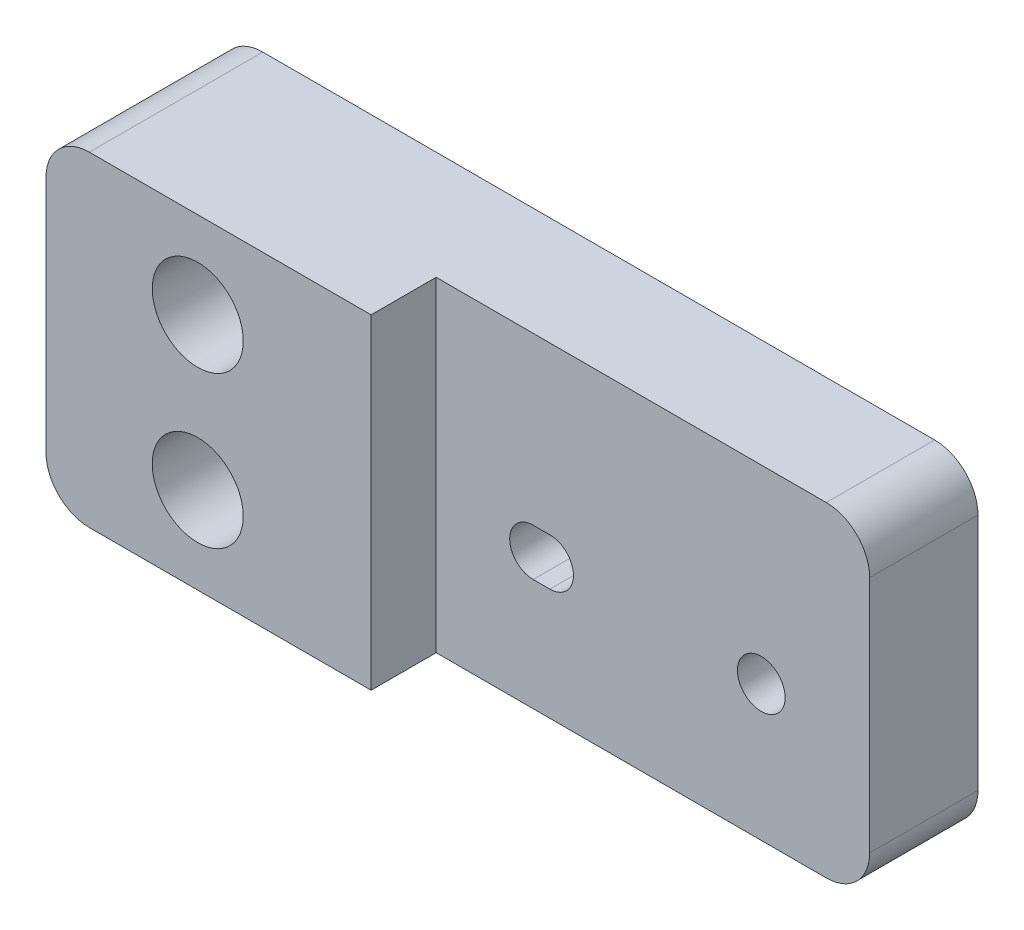
ISO-10303-21;
HEADER;
FILE_DESCRIPTION(('STEP AP214'),'2;1');
FILE_NAME('part.step','',(''),(''),'','','');
FILE_SCHEMA(('AUTOMOTIVE_DESIGN { 1 0 10303 214 1 1 1 1 }'));
ENDSEC;
DATA;
#1=APPLICATION_CONTEXT('core data for automotive mechanical design processes');
#2=APPLICATION_PROTOCOL_DEFINITION('international standard','automotive_design',2000,#1);
#3=PRODUCT_CONTEXT('',#1,'mechanical');
#4=PRODUCT('Part','Part','',(#3));
#5=PRODUCT_RELATED_PRODUCT_CATEGORY('part','',(#4));
#6=PRODUCT_DEFINITION_FORMATION('','',#4);
#7=PRODUCT_DEFINITION_CONTEXT('part definition',#1,'design');
#8=PRODUCT_DEFINITION('design','',#6,#7);
#9=PRODUCT_DEFINITION_SHAPE('','',#8);
#10=(LENGTH_UNIT() NAMED_UNIT(*) SI_UNIT(.MILLI.,.METRE.));
#11=(NAMED_UNIT(*) PLANE_ANGLE_UNIT() SI_UNIT($,.RADIAN.));
#12=(NAMED_UNIT(*) SI_UNIT($,.STERADIAN.) SOLID_ANGLE_UNIT());
#13=UNCERTAINTY_MEASURE_WITH_UNIT(LENGTH_MEASURE(1.E-05),#10,'distance_accuracy_value','');
#14=(GEOMETRIC_REPRESENTATION_CONTEXT(3) GLOBAL_UNCERTAINTY_ASSIGNED_CONTEXT((#13)) GLOBAL_UNIT_ASSIGNED_CONTEXT((#10,
#11,#12)) REPRESENTATION_CONTEXT('',''));
#15=CARTESIAN_POINT('',(0.,0.,0.));
#16=DIRECTION('',(0.,0.,1.));
#17=DIRECTION('',(1.,0.,0.));
#18=AXIS2_PLACEMENT_3D('',#15,#16,#17);
#19=CARTESIAN_POINT('',(-13.,-12.25,5.));
#20=DIRECTION('',(0.,0.,-1.));
#21=DIRECTION('',(-1.,0.,0.));
#22=AXIS2_PLACEMENT_3D('',#19,#20,#21);
#23=PLANE('',#22);
#24=CARTESIAN_POINT('',(15.,-7.99752344134587,5.));
#25=DIRECTION('',(0.,0.,-1.));
#26=DIRECTION('',(-1.,0.,0.));
#27=AXIS2_PLACEMENT_3D('',#24,#25,#26);
#28=CIRCLE('',#27,1.1);
#29=CARTESIAN_POINT('',(13.9,-7.99752344134587,5.));
#30=VERTEX_POINT('',#29);
#31=EDGE_CURVE('E269',#30,#30,#28,.T.);
#32=ORIENTED_EDGE('',*,*,#31,.T.);
#33=EDGE_LOOP('',(#32));
#34=FACE_BOUND('',#33,.T.);
#35=DIRECTION('',(1.,0.,0.));
#36=VECTOR('',#35,1.);
#37=CARTESIAN_POINT('',(-13.,-6.91475813064418,5.));
#38=LINE('',#37,#36);
#39=CARTESIAN_POINT('',(4.47844965742789,-6.91475813064418,5.));
#40=VERTEX_POINT('',#39);
#41=CARTESIAN_POINT('',(5.24999988265336,-6.91475813064418,5.));
#42=VERTEX_POINT('',#41);
#43=EDGE_CURVE('E263',#40,#42,#38,.T.);
#44=ORIENTED_EDGE('',*,*,#43,.T.);
#45=CARTESIAN_POINT('',(5.24999988265336,-7.99999981001019,5.));
#46=DIRECTION('',(0.,0.,-1.));
#47=DIRECTION('',(-1.,0.,0.));
#48=AXIS2_PLACEMENT_3D('',#45,#46,#47);
#49=CIRCLE('',#48,1.08524167936601);
#50=CARTESIAN_POINT('',(5.24999988265336,-9.0852414893762,5.));
#51=VERTEX_POINT('',#50);
#52=EDGE_CURVE('E266',#42,#51,#49,.T.);
#53=ORIENTED_EDGE('',*,*,#52,.T.);
#54=DIRECTION('',(-1.,0.,0.));
#55=VECTOR('',#54,1.);
#56=CARTESIAN_POINT('',(-13.,-9.0852414893762,5.));
#57=LINE('',#56,#55);
#58=CARTESIAN_POINT('',(4.47844965742789,-9.0852414893762,5.));
#59=VERTEX_POINT('',#58);
#60=EDGE_CURVE('E260',#51,#59,#57,.T.);
#61=ORIENTED_EDGE('',*,*,#60,.T.);
#62=CARTESIAN_POINT('',(4.47844965742789,-7.99999981001019,5.));
#63=DIRECTION('',(0.,0.,-1.));
#64=DIRECTION('',(-1.,0.,0.));
#65=AXIS2_PLACEMENT_3D('',#62,#63,#64);
#66=CIRCLE('',#65,1.08524167936601);
#67=EDGE_CURVE('E237',#59,#40,#66,.T.);
#68=ORIENTED_EDGE('',*,*,#67,.T.);
#69=EDGE_LOOP('',(#44,#53,#61,#68));
#70=FACE_BOUND('',#69,.T.);
#71=DIRECTION('',(-1.,0.,0.));
#72=VECTOR('',#71,1.);
#73=CARTESIAN_POINT('',(18.,0.749999999999999,5.));
#74=LINE('',#73,#72);
#75=CARTESIAN_POINT('',(18.,0.749999999999999,5.));
#76=VERTEX_POINT('',#75);
#77=CARTESIAN_POINT('',(0.,0.749999999999996,5.));
#78=VERTEX_POINT('',#77);
#79=EDGE_CURVE('E322',#76,#78,#74,.T.);
#80=ORIENTED_EDGE('',*,*,#79,.T.);
#81=DIRECTION('',(0.,-1.,0.));
#82=VECTOR('',#81,1.);
#83=CARTESIAN_POINT('',(0.,0.749999999999996,5.));
#84=LINE('',#83,#82);
#85=CARTESIAN_POINT('',(0.,-14.25,5.));
#86=VERTEX_POINT('',#85);
#87=EDGE_CURVE('E278',#78,#86,#84,.T.);
#88=ORIENTED_EDGE('',*,*,#87,.T.);
#89=DIRECTION('',(-1.,0.,0.));
#90=VECTOR('',#89,1.);
#91=CARTESIAN_POINT('',(18.,-14.25,5.));
#92=LINE('',#91,#90);
#93=CARTESIAN_POINT('',(18.,-14.25,5.));
#94=VERTEX_POINT('',#93);
#95=EDGE_CURVE('E309',#94,#86,#92,.T.);
#96=ORIENTED_EDGE('',*,*,#95,.F.);
#97=CARTESIAN_POINT('',(18.,-12.25,5.));
#98=DIRECTION('',(0.,0.,-1.));
#99=DIRECTION('',(-1.,0.,0.));
#100=AXIS2_PLACEMENT_3D('',#97,#98,#99);
#101=CIRCLE('',#100,2.);
#102=CARTESIAN_POINT('',(20.,-12.25,5.));
#103=VERTEX_POINT('',#102);
#104=EDGE_CURVE('E312',#103,#94,#101,.T.);
#105=ORIENTED_EDGE('',*,*,#104,.F.);
#106=DIRECTION('',(0.,-1.,0.));
#107=VECTOR('',#106,1.);
#108=CARTESIAN_POINT('',(20.,-1.25000000000001,5.));
#109=LINE('',#108,#107);
#110=CARTESIAN_POINT('',(20.,-1.25000000000001,5.));
#111=VERTEX_POINT('',#110);
#112=EDGE_CURVE('E316',#111,#103,#109,.T.);
#113=ORIENTED_EDGE('',*,*,#112,.F.);
#114=CARTESIAN_POINT('',(18.,-1.25,5.));
#115=DIRECTION('',(0.,0.,-1.));
#116=DIRECTION('',(-1.,0.,0.));
#117=AXIS2_PLACEMENT_3D('',#114,#115,#116);
#118=CIRCLE('',#117,2.);
#119=EDGE_CURVE('E319',#76,#111,#118,.T.);
#120=ORIENTED_EDGE('',*,*,#119,.F.);
#121=EDGE_LOOP('',(#80,#88,#96,#105,#113,#120));
#122=FACE_BOUND('',#121,.T.);
#123=ADVANCED_FACE('F131',(#34,#70,#122),#23,.F.);
#124=CARTESIAN_POINT('',(-13.,-12.25,0.));
#125=DIRECTION('',(0.,0.,-1.));
#126=DIRECTION('',(-1.,0.,0.));
#127=AXIS2_PLACEMENT_3D('',#124,#125,#126);
#128=PLANE('',#127);
#129=CARTESIAN_POINT('',(15.,-7.99752344134587,0.));
#130=DIRECTION('',(0.,0.,-1.));
#131=DIRECTION('',(-1.,0.,0.));
#132=AXIS2_PLACEMENT_3D('',#129,#130,#131);
#133=CIRCLE('',#132,1.1);
#134=CARTESIAN_POINT('',(13.9,-7.99752344134587,0.));
#135=VERTEX_POINT('',#134);
#136=EDGE_CURVE('E257',#135,#135,#133,.T.);
#137=ORIENTED_EDGE('',*,*,#136,.F.);
#138=EDGE_LOOP('',(#137));
#139=FACE_BOUND('',#138,.T.);
#140=CARTESIAN_POINT('',(5.24999988265336,-7.99999981001019,0.));
#141=DIRECTION('',(0.,0.,-1.));
#142=DIRECTION('',(-1.,0.,0.));
#143=AXIS2_PLACEMENT_3D('',#140,#141,#142);
#144=CIRCLE('',#143,1.08524167936601);
#145=CARTESIAN_POINT('',(5.24999988265336,-6.91475813064418,0.));
#146=VERTEX_POINT('',#145);
#147=CARTESIAN_POINT('',(5.24999988265336,-9.0852414893762,0.));
#148=VERTEX_POINT('',#147);
#149=EDGE_CURVE('E154',#146,#148,#144,.T.);
#150=ORIENTED_EDGE('',*,*,#149,.F.);
#151=DIRECTION('',(1.,0.,0.));
#152=VECTOR('',#151,1.);
#153=CARTESIAN_POINT('',(5.24999988265336,-6.91475813064418,0.));
#154=LINE('',#153,#152);
#155=CARTESIAN_POINT('',(4.47844965742789,-6.91475813064418,0.));
#156=VERTEX_POINT('',#155);
#157=EDGE_CURVE('E250',#156,#146,#154,.T.);
#158=ORIENTED_EDGE('',*,*,#157,.F.);
#159=CARTESIAN_POINT('',(4.47844965742789,-7.99999981001019,0.));
#160=DIRECTION('',(0.,0.,-1.));
#161=DIRECTION('',(-1.,0.,0.));
#162=AXIS2_PLACEMENT_3D('',#159,#160,#161);
#163=CIRCLE('',#162,1.08524167936601);
#164=CARTESIAN_POINT('',(4.47844965742789,-9.0852414893762,0.));
#165=VERTEX_POINT('',#164);
#166=EDGE_CURVE('E234',#165,#156,#163,.T.);
#167=ORIENTED_EDGE('',*,*,#166,.F.);
#168=DIRECTION('',(-1.,0.,0.));
#169=VECTOR('',#168,1.);
#170=CARTESIAN_POINT('',(5.24999988265336,-9.0852414893762,0.));
#171=LINE('',#170,#169);
#172=EDGE_CURVE('E243',#148,#165,#171,.T.);
#173=ORIENTED_EDGE('',*,*,#172,.F.);
#174=EDGE_LOOP('',(#150,#158,#167,#173));
#175=FACE_BOUND('',#174,.T.);
#176=CARTESIAN_POINT('',(-8.,-10.25,0.));
#177=DIRECTION('',(0.,0.,1.));
#178=DIRECTION('',(1.,0.,0.));
#179=AXIS2_PLACEMENT_3D('',#176,#177,#178);
#180=CIRCLE('',#179,2.1);
#181=CARTESIAN_POINT('',(-5.9,-10.25,0.));
#182=VERTEX_POINT('',#181);
#183=EDGE_CURVE('E305',#182,#182,#180,.T.);
#184=ORIENTED_EDGE('',*,*,#183,.T.);
#185=EDGE_LOOP('',(#184));
#186=FACE_BOUND('',#185,.T.);
#187=DIRECTION('',(0.,-1.,0.));
#188=VECTOR('',#187,1.);
#189=CARTESIAN_POINT('',(-15.,-1.25,0.));
#190=LINE('',#189,#188);
#191=CARTESIAN_POINT('',(-15.,-1.25,0.));
#192=VERTEX_POINT('',#191);
#193=CARTESIAN_POINT('',(-15.,-12.25,0.));
#194=VERTEX_POINT('',#193);
#195=EDGE_CURVE('E308',#192,#194,#190,.T.);
#196=ORIENTED_EDGE('',*,*,#195,.F.);
#197=CARTESIAN_POINT('',(-13.,-1.25,0.));
#198=DIRECTION('',(0.,0.,1.));
#199=DIRECTION('',(1.,0.,0.));
#200=AXIS2_PLACEMENT_3D('',#197,#198,#199);
#201=CIRCLE('',#200,2.);
#202=CARTESIAN_POINT('',(-13.,0.749999999999996,0.));
#203=VERTEX_POINT('',#202);
#204=EDGE_CURVE('E313',#203,#192,#201,.T.);
#205=ORIENTED_EDGE('',*,*,#204,.F.);
#206=DIRECTION('',(-1.,0.,0.));
#207=VECTOR('',#206,1.);
#208=CARTESIAN_POINT('',(18.,0.749999999999999,0.));
#209=LINE('',#208,#207);
#210=CARTESIAN_POINT('',(18.,0.749999999999999,0.));
#211=VERTEX_POINT('',#210);
#212=EDGE_CURVE('E343',#211,#203,#209,.T.);
#213=ORIENTED_EDGE('',*,*,#212,.F.);
#214=CARTESIAN_POINT('',(18.,-1.25,0.));
#215=DIRECTION('',(0.,0.,-1.));
#216=DIRECTION('',(-1.,0.,0.));
#217=AXIS2_PLACEMENT_3D('',#214,#215,#216);
#218=CIRCLE('',#217,2.);
#219=CARTESIAN_POINT('',(20.,-1.25000000000001,0.));
#220=VERTEX_POINT('',#219);
#221=EDGE_CURVE('E340',#211,#220,#218,.T.);
#222=ORIENTED_EDGE('',*,*,#221,.T.);
#223=DIRECTION('',(0.,-1.,0.));
#224=VECTOR('',#223,1.);
#225=CARTESIAN_POINT('',(20.,-1.25000000000001,0.));
#226=LINE('',#225,#224);
#227=CARTESIAN_POINT('',(20.,-12.25,0.));
#228=VERTEX_POINT('',#227);
#229=EDGE_CURVE('E337',#220,#228,#226,.T.);
#230=ORIENTED_EDGE('',*,*,#229,.T.);
#231=CARTESIAN_POINT('',(18.,-12.25,0.));
#232=DIRECTION('',(0.,0.,-1.));
#233=DIRECTION('',(-1.,0.,0.));
#234=AXIS2_PLACEMENT_3D('',#231,#232,#233);
#235=CIRCLE('',#234,2.);
#236=CARTESIAN_POINT('',(18.,-14.25,0.));
#237=VERTEX_POINT('',#236);
#238=EDGE_CURVE('E334',#228,#237,#235,.T.);
#239=ORIENTED_EDGE('',*,*,#238,.T.);
#240=DIRECTION('',(-1.,0.,0.));
#241=VECTOR('',#240,1.);
#242=CARTESIAN_POINT('',(18.,-14.25,0.));
#243=LINE('',#242,#241);
#244=CARTESIAN_POINT('',(-13.,-14.25,0.));
#245=VERTEX_POINT('',#244);
#246=EDGE_CURVE('E331',#237,#245,#243,.T.);
#247=ORIENTED_EDGE('',*,*,#246,.T.);
#248=CARTESIAN_POINT('',(-13.,-12.25,0.));
#249=DIRECTION('',(0.,0.,-1.));
#250=DIRECTION('',(-1.,0.,0.));
#251=AXIS2_PLACEMENT_3D('',#248,#249,#250);
#252=CIRCLE('',#251,2.);
#253=EDGE_CURVE('E328',#245,#194,#252,.T.);
#254=ORIENTED_EDGE('',*,*,#253,.T.);
#255=EDGE_LOOP('',(#196,#205,#213,#222,#230,#239,#247,#254));
#256=FACE_BOUND('',#255,.T.);
#257=CARTESIAN_POINT('',(-8.,-3.25,0.));
#258=DIRECTION('',(0.,0.,1.));
#259=DIRECTION('',(1.,0.,0.));
#260=AXIS2_PLACEMENT_3D('',#257,#258,#259);
#261=CIRCLE('',#260,2.1);
#262=CARTESIAN_POINT('',(-5.9,-3.25,0.));
#263=VERTEX_POINT('',#262);
#264=EDGE_CURVE('E302',#263,#263,#261,.T.);
#265=ORIENTED_EDGE('',*,*,#264,.T.);
#266=EDGE_LOOP('',(#265));
#267=FACE_BOUND('',#266,.T.);
#268=ADVANCED_FACE('F247',(#139,#175,#186,#256,#267),#128,.T.);
#269=CARTESIAN_POINT('',(-15.,-1.25,5.));
#270=DIRECTION('',(1.,0.,0.));
#271=DIRECTION('',(0.,1.,0.));
#272=AXIS2_PLACEMENT_3D('',#269,#270,#271);
#273=PLANE('',#272);
#274=ORIENTED_EDGE('',*,*,#195,.T.);
#275=DIRECTION('',(0.,0.,-1.));
#276=VECTOR('',#275,1.);
#277=CARTESIAN_POINT('',(-15.,-12.25,5.));
#278=LINE('',#277,#276);
#279=CARTESIAN_POINT('',(-15.,-12.25,8.));
#280=VERTEX_POINT('',#279);
#281=EDGE_CURVE('E12',#280,#194,#278,.T.);
#282=ORIENTED_EDGE('',*,*,#281,.F.);
#283=DIRECTION('',(0.,-1.,0.));
#284=VECTOR('',#283,1.);
#285=CARTESIAN_POINT('',(-15.,-1.25,8.));
#286=LINE('',#285,#284);
#287=CARTESIAN_POINT('',(-15.,-1.25,8.));
#288=VERTEX_POINT('',#287);
#289=EDGE_CURVE('E282',#288,#280,#286,.T.);
#290=ORIENTED_EDGE('',*,*,#289,.F.);
#291=DIRECTION('',(0.,0.,-1.));
#292=VECTOR('',#291,1.);
#293=CARTESIAN_POINT('',(-15.,-1.25,5.));
#294=LINE('',#293,#292);
#295=EDGE_CURVE('E325',#288,#192,#294,.T.);
#296=ORIENTED_EDGE('',*,*,#295,.T.);
#297=EDGE_LOOP('',(#274,#282,#290,#296));
#298=FACE_BOUND('',#297,.T.);
#299=ADVANCED_FACE('F133',(#298),#273,.F.);
#300=CARTESIAN_POINT('',(-13.,-12.25,5.));
#301=DIRECTION('',(0.,0.,-1.));
#302=DIRECTION('',(-1.,0.,0.));
#303=AXIS2_PLACEMENT_3D('',#300,#301,#302);
#304=CYLINDRICAL_SURFACE('',#303,2.);
#305=ORIENTED_EDGE('',*,*,#253,.F.);
#306=DIRECTION('',(0.,0.,-1.));
#307=VECTOR('',#306,1.);
#308=CARTESIAN_POINT('',(-13.,-14.25,5.));
#309=LINE('',#308,#307);
#310=CARTESIAN_POINT('',(-13.,-14.25,8.));
#311=VERTEX_POINT('',#310);
#312=EDGE_CURVE('E139',#311,#245,#309,.T.);
#313=ORIENTED_EDGE('',*,*,#312,.F.);
#314=CARTESIAN_POINT('',(-13.,-12.25,8.));
#315=DIRECTION('',(0.,0.,1.));
#316=DIRECTION('',(1.,0.,0.));
#317=AXIS2_PLACEMENT_3D('',#314,#315,#316);
#318=CIRCLE('',#317,2.);
#319=EDGE_CURVE('E285',#280,#311,#318,.T.);
#320=ORIENTED_EDGE('',*,*,#319,.F.);
#321=ORIENTED_EDGE('',*,*,#281,.T.);
#322=EDGE_LOOP('',(#305,#313,#320,#321));
#323=FACE_BOUND('',#322,.T.);
#324=ADVANCED_FACE('F366',(#323),#304,.T.);
#325=CARTESIAN_POINT('',(18.,-14.25,5.));
#326=DIRECTION('',(0.,-1.,0.));
#327=DIRECTION('',(1.,0.,0.));
#328=AXIS2_PLACEMENT_3D('',#325,#326,#327);
#329=PLANE('',#328);
#330=ORIENTED_EDGE('',*,*,#246,.F.);
#331=DIRECTION('',(0.,0.,-1.));
#332=VECTOR('',#331,1.);
#333=CARTESIAN_POINT('',(18.,-14.25,5.));
#334=LINE('',#333,#332);
#335=EDGE_CURVE('E357',#94,#237,#334,.T.);
#336=ORIENTED_EDGE('',*,*,#335,.F.);
#337=ORIENTED_EDGE('',*,*,#95,.T.);
#338=DIRECTION('',(0.,0.,-1.));
#339=VECTOR('',#338,1.);
#340=CARTESIAN_POINT('',(0.,-14.25,8.));
#341=LINE('',#340,#339);
#342=CARTESIAN_POINT('',(0.,-14.25,8.));
#343=VERTEX_POINT('',#342);
#344=EDGE_CURVE('E300',#343,#86,#341,.T.);
#345=ORIENTED_EDGE('',*,*,#344,.F.);
#346=DIRECTION('',(1.,0.,0.));
#347=VECTOR('',#346,1.);
#348=CARTESIAN_POINT('',(-13.,-14.25,8.));
#349=LINE('',#348,#347);
#350=EDGE_CURVE('E288',#311,#343,#349,.T.);
#351=ORIENTED_EDGE('',*,*,#350,.F.);
#352=ORIENTED_EDGE('',*,*,#312,.T.);
#353=EDGE_LOOP('',(#330,#336,#337,#345,#351,#352));
#354=FACE_BOUND('',#353,.T.);
#355=ADVANCED_FACE('F362',(#354),#329,.T.);
#356=CARTESIAN_POINT('',(18.,-12.25,5.));
#357=DIRECTION('',(0.,0.,-1.));
#358=DIRECTION('',(-1.,0.,0.));
#359=AXIS2_PLACEMENT_3D('',#356,#357,#358);
#360=CYLINDRICAL_SURFACE('',#359,2.);
#361=ORIENTED_EDGE('',*,*,#238,.F.);
#362=DIRECTION('',(0.,0.,-1.));
#363=VECTOR('',#362,1.);
#364=CARTESIAN_POINT('',(20.,-12.25,5.));
#365=LINE('',#364,#363);
#366=EDGE_CURVE('E355',#103,#228,#365,.T.);
#367=ORIENTED_EDGE('',*,*,#366,.F.);
#368=ORIENTED_EDGE('',*,*,#104,.T.);
#369=ORIENTED_EDGE('',*,*,#335,.T.);
#370=EDGE_LOOP('',(#361,#367,#368,#369));
#371=FACE_BOUND('',#370,.T.);
#372=ADVANCED_FACE('F373',(#371),#360,.T.);
#373=CARTESIAN_POINT('',(20.,-1.25000000000001,5.));
#374=DIRECTION('',(1.,0.,0.));
#375=DIRECTION('',(0.,1.,0.));
#376=AXIS2_PLACEMENT_3D('',#373,#374,#375);
#377=PLANE('',#376);
#378=ORIENTED_EDGE('',*,*,#229,.F.);
#379=DIRECTION('',(0.,0.,-1.));
#380=VECTOR('',#379,1.);
#381=CARTESIAN_POINT('',(20.,-1.25000000000001,5.));
#382=LINE('',#381,#380);
#383=EDGE_CURVE('E353',#111,#220,#382,.T.);
#384=ORIENTED_EDGE('',*,*,#383,.F.);
#385=ORIENTED_EDGE('',*,*,#112,.T.);
#386=ORIENTED_EDGE('',*,*,#366,.T.);
#387=EDGE_LOOP('',(#378,#384,#385,#386));
#388=FACE_BOUND('',#387,.T.);
#389=ADVANCED_FACE('F401',(#388),#377,.T.);
#390=CARTESIAN_POINT('',(18.,-1.25,5.));
#391=DIRECTION('',(0.,0.,-1.));
#392=DIRECTION('',(-1.,0.,0.));
#393=AXIS2_PLACEMENT_3D('',#390,#391,#392);
#394=CYLINDRICAL_SURFACE('',#393,2.);
#395=ORIENTED_EDGE('',*,*,#221,.F.);
#396=DIRECTION('',(0.,0.,-1.));
#397=VECTOR('',#396,1.);
#398=CARTESIAN_POINT('',(18.,0.749999999999999,5.));
#399=LINE('',#398,#397);
#400=EDGE_CURVE('E351',#76,#211,#399,.T.);
#401=ORIENTED_EDGE('',*,*,#400,.F.);
#402=ORIENTED_EDGE('',*,*,#119,.T.);
#403=ORIENTED_EDGE('',*,*,#383,.T.);
#404=EDGE_LOOP('',(#395,#401,#402,#403));
#405=FACE_BOUND('',#404,.T.);
#406=ADVANCED_FACE('F399',(#405),#394,.T.);
#407=CARTESIAN_POINT('',(18.,0.749999999999999,5.));
#408=DIRECTION('',(0.,-1.,0.));
#409=DIRECTION('',(1.,0.,0.));
#410=AXIS2_PLACEMENT_3D('',#407,#408,#409);
#411=PLANE('',#410);
#412=ORIENTED_EDGE('',*,*,#212,.T.);
#413=DIRECTION('',(0.,0.,-1.));
#414=VECTOR('',#413,1.);
#415=CARTESIAN_POINT('',(-13.,0.749999999999996,5.));
#416=LINE('',#415,#414);
#417=CARTESIAN_POINT('',(-13.,0.749999999999996,8.));
#418=VERTEX_POINT('',#417);
#419=EDGE_CURVE('E348',#418,#203,#416,.T.);
#420=ORIENTED_EDGE('',*,*,#419,.F.);
#421=DIRECTION('',(-1.,0.,0.));
#422=VECTOR('',#421,1.);
#423=CARTESIAN_POINT('',(0.,0.749999999999996,8.));
#424=LINE('',#423,#422);
#425=CARTESIAN_POINT('',(0.,0.749999999999996,8.));
#426=VERTEX_POINT('',#425);
#427=EDGE_CURVE('E293',#426,#418,#424,.T.);
#428=ORIENTED_EDGE('',*,*,#427,.F.);
#429=DIRECTION('',(0.,0.,-1.));
#430=VECTOR('',#429,1.);
#431=CARTESIAN_POINT('',(0.,0.749999999999996,8.));
#432=LINE('',#431,#430);
#433=EDGE_CURVE('E296',#426,#78,#432,.T.);
#434=ORIENTED_EDGE('',*,*,#433,.T.);
#435=ORIENTED_EDGE('',*,*,#79,.F.);
#436=ORIENTED_EDGE('',*,*,#400,.T.);
#437=EDGE_LOOP('',(#412,#420,#428,#434,#435,#436));
#438=FACE_BOUND('',#437,.T.);
#439=ADVANCED_FACE('F397',(#438),#411,.F.);
#440=CARTESIAN_POINT('',(-13.,-1.25,5.));
#441=DIRECTION('',(0.,0.,-1.));
#442=DIRECTION('',(-1.,0.,0.));
#443=AXIS2_PLACEMENT_3D('',#440,#441,#442);
#444=CYLINDRICAL_SURFACE('',#443,2.);
#445=ORIENTED_EDGE('',*,*,#204,.T.);
#446=ORIENTED_EDGE('',*,*,#295,.F.);
#447=CARTESIAN_POINT('',(-13.,-1.25,8.));
#448=DIRECTION('',(0.,0.,1.));
#449=DIRECTION('',(1.,0.,0.));
#450=AXIS2_PLACEMENT_3D('',#447,#448,#449);
#451=CIRCLE('',#450,2.);
#452=EDGE_CURVE('E279',#418,#288,#451,.T.);
#453=ORIENTED_EDGE('',*,*,#452,.F.);
#454=ORIENTED_EDGE('',*,*,#419,.T.);
#455=EDGE_LOOP('',(#445,#446,#453,#454));
#456=FACE_BOUND('',#455,.T.);
#457=ADVANCED_FACE('F395',(#456),#444,.T.);
#458=CARTESIAN_POINT('',(-8.,-10.25,5.));
#459=DIRECTION('',(0.,0.,-1.));
#460=DIRECTION('',(-1.,0.,0.));
#461=AXIS2_PLACEMENT_3D('',#458,#459,#460);
#462=CYLINDRICAL_SURFACE('',#461,2.1);
#463=ORIENTED_EDGE('',*,*,#183,.F.);
#464=EDGE_LOOP('',(#463));
#465=FACE_BOUND('',#464,.T.);
#466=CARTESIAN_POINT('',(-8.,-10.25,8.));
#467=DIRECTION('',(0.,0.,1.));
#468=DIRECTION('',(1.,0.,0.));
#469=AXIS2_PLACEMENT_3D('',#466,#467,#468);
#470=CIRCLE('',#469,2.1);
#471=CARTESIAN_POINT('',(-5.9,-10.25,8.));
#472=VERTEX_POINT('',#471);
#473=EDGE_CURVE('E272',#472,#472,#470,.T.);
#474=ORIENTED_EDGE('',*,*,#473,.T.);
#475=EDGE_LOOP('',(#474));
#476=FACE_BOUND('',#475,.T.);
#477=ADVANCED_FACE('F421',(#465,#476),#462,.F.);
#478=CARTESIAN_POINT('',(-8.,-3.25,5.));
#479=DIRECTION('',(0.,0.,-1.));
#480=DIRECTION('',(-1.,0.,0.));
#481=AXIS2_PLACEMENT_3D('',#478,#479,#480);
#482=CYLINDRICAL_SURFACE('',#481,2.1);
#483=ORIENTED_EDGE('',*,*,#264,.F.);
#484=EDGE_LOOP('',(#483));
#485=FACE_BOUND('',#484,.T.);
#486=CARTESIAN_POINT('',(-8.,-3.25,8.));
#487=DIRECTION('',(0.,0.,1.));
#488=DIRECTION('',(1.,0.,0.));
#489=AXIS2_PLACEMENT_3D('',#486,#487,#488);
#490=CIRCLE('',#489,2.1);
#491=CARTESIAN_POINT('',(-5.9,-3.25,8.));
#492=VERTEX_POINT('',#491);
#493=EDGE_CURVE('E275',#492,#492,#490,.T.);
#494=ORIENTED_EDGE('',*,*,#493,.T.);
#495=EDGE_LOOP('',(#494));
#496=FACE_BOUND('',#495,.T.);
#497=ADVANCED_FACE('F443',(#485,#496),#482,.F.);
#498=CARTESIAN_POINT('',(-13.,-1.25,8.));
#499=DIRECTION('',(0.,0.,1.));
#500=DIRECTION('',(1.,0.,0.));
#501=AXIS2_PLACEMENT_3D('',#498,#499,#500);
#502=PLANE('',#501);
#503=ORIENTED_EDGE('',*,*,#493,.F.);
#504=EDGE_LOOP('',(#503));
#505=FACE_BOUND('',#504,.T.);
#506=ORIENTED_EDGE('',*,*,#452,.T.);
#507=ORIENTED_EDGE('',*,*,#289,.T.);
#508=ORIENTED_EDGE('',*,*,#319,.T.);
#509=ORIENTED_EDGE('',*,*,#350,.T.);
#510=DIRECTION('',(0.,-1.,0.));
#511=VECTOR('',#510,1.);
#512=CARTESIAN_POINT('',(0.,0.749999999999996,8.));
#513=LINE('',#512,#511);
#514=EDGE_CURVE('E290',#426,#343,#513,.T.);
#515=ORIENTED_EDGE('',*,*,#514,.F.);
#516=ORIENTED_EDGE('',*,*,#427,.T.);
#517=EDGE_LOOP('',(#506,#507,#508,#509,#515,#516));
#518=FACE_BOUND('',#517,.T.);
#519=ORIENTED_EDGE('',*,*,#473,.F.);
#520=EDGE_LOOP('',(#519));
#521=FACE_BOUND('',#520,.T.);
#522=ADVANCED_FACE('F386',(#505,#518,#521),#502,.T.);
#523=CARTESIAN_POINT('',(0.,0.749999999999996,8.));
#524=DIRECTION('',(1.,0.,0.));
#525=DIRECTION('',(0.,1.,0.));
#526=AXIS2_PLACEMENT_3D('',#523,#524,#525);
#527=PLANE('',#526);
#528=ORIENTED_EDGE('',*,*,#87,.F.);
#529=ORIENTED_EDGE('',*,*,#433,.F.);
#530=ORIENTED_EDGE('',*,*,#514,.T.);
#531=ORIENTED_EDGE('',*,*,#344,.T.);
#532=EDGE_LOOP('',(#528,#529,#530,#531));
#533=FACE_BOUND('',#532,.T.);
#534=ADVANCED_FACE('F382',(#533),#527,.T.);
#535=CARTESIAN_POINT('',(5.24999988265336,-7.99999981001019,10.));
#536=DIRECTION('',(0.,0.,-1.));
#537=DIRECTION('',(-1.,0.,0.));
#538=AXIS2_PLACEMENT_3D('',#535,#536,#537);
#539=CYLINDRICAL_SURFACE('',#538,1.08524167936601);
#540=DIRECTION('',(0.,0.,-1.));
#541=VECTOR('',#540,1.);
#542=CARTESIAN_POINT('',(5.24999988265336,-6.91475813064418,10.));
#543=LINE('',#542,#541);
#544=EDGE_CURVE('E255',#42,#146,#543,.T.);
#545=ORIENTED_EDGE('',*,*,#544,.T.);
#546=ORIENTED_EDGE('',*,*,#149,.T.);
#547=DIRECTION('',(0.,0.,-1.));
#548=VECTOR('',#547,1.);
#549=CARTESIAN_POINT('',(5.24999988265336,-9.0852414893762,10.));
#550=LINE('',#549,#548);
#551=EDGE_CURVE('E240',#51,#148,#550,.T.);
#552=ORIENTED_EDGE('',*,*,#551,.F.);
#553=ORIENTED_EDGE('',*,*,#52,.F.);
#554=EDGE_LOOP('',(#545,#546,#552,#553));
#555=FACE_BOUND('',#554,.T.);
#556=ADVANCED_FACE('F462',(#555),#539,.F.);
#557=CARTESIAN_POINT('',(5.24999988265336,-6.91475813064418,10.));
#558=DIRECTION('',(0.,1.,0.));
#559=DIRECTION('',(0.,0.,1.));
#560=AXIS2_PLACEMENT_3D('',#557,#558,#559);
#561=PLANE('',#560);
#562=DIRECTION('',(0.,0.,-1.));
#563=VECTOR('',#562,1.);
#564=CARTESIAN_POINT('',(4.47844965742789,-6.91475813064418,10.));
#565=LINE('',#564,#563);
#566=EDGE_CURVE('E239',#40,#156,#565,.T.);
#567=ORIENTED_EDGE('',*,*,#566,.T.);
#568=ORIENTED_EDGE('',*,*,#157,.T.);
#569=ORIENTED_EDGE('',*,*,#544,.F.);
#570=ORIENTED_EDGE('',*,*,#43,.F.);
#571=EDGE_LOOP('',(#567,#568,#569,#570));
#572=FACE_BOUND('',#571,.T.);
#573=ADVANCED_FACE('F469',(#572),#561,.F.);
#574=CARTESIAN_POINT('',(4.47844965742789,-7.99999981001019,10.));
#575=DIRECTION('',(0.,0.,-1.));
#576=DIRECTION('',(-1.,0.,0.));
#577=AXIS2_PLACEMENT_3D('',#574,#575,#576);
#578=CYLINDRICAL_SURFACE('',#577,1.08524167936601);
#579=DIRECTION('',(0.,0.,-1.));
#580=VECTOR('',#579,1.);
#581=CARTESIAN_POINT('',(4.47844965742789,-9.0852414893762,10.));
#582=LINE('',#581,#580);
#583=EDGE_CURVE('E146',#59,#165,#582,.T.);
#584=ORIENTED_EDGE('',*,*,#583,.T.);
#585=ORIENTED_EDGE('',*,*,#166,.T.);
#586=ORIENTED_EDGE('',*,*,#566,.F.);
#587=ORIENTED_EDGE('',*,*,#67,.F.);
#588=EDGE_LOOP('',(#584,#585,#586,#587));
#589=FACE_BOUND('',#588,.T.);
#590=ADVANCED_FACE('F231',(#589),#578,.F.);
#591=CARTESIAN_POINT('',(5.24999988265336,-9.0852414893762,10.));
#592=DIRECTION('',(0.,-1.,0.));
#593=DIRECTION('',(0.,0.,-1.));
#594=AXIS2_PLACEMENT_3D('',#591,#592,#593);
#595=PLANE('',#594);
#596=ORIENTED_EDGE('',*,*,#551,.T.);
#597=ORIENTED_EDGE('',*,*,#172,.T.);
#598=ORIENTED_EDGE('',*,*,#583,.F.);
#599=ORIENTED_EDGE('',*,*,#60,.F.);
#600=EDGE_LOOP('',(#596,#597,#598,#599));
#601=FACE_BOUND('',#600,.T.);
#602=ADVANCED_FACE('F244',(#601),#595,.F.);
#603=CARTESIAN_POINT('',(15.,-7.99752344134587,10.));
#604=DIRECTION('',(0.,0.,-1.));
#605=DIRECTION('',(-1.,0.,0.));
#606=AXIS2_PLACEMENT_3D('',#603,#604,#605);
#607=CYLINDRICAL_SURFACE('',#606,1.1);
#608=ORIENTED_EDGE('',*,*,#136,.T.);
#609=EDGE_LOOP('',(#608));
#610=FACE_BOUND('',#609,.T.);
#611=ORIENTED_EDGE('',*,*,#31,.F.);
#612=EDGE_LOOP('',(#611));
#613=FACE_BOUND('',#612,.T.);
#614=ADVANCED_FACE('F489',(#610,#613),#607,.F.);
#615=CLOSED_SHELL('',(#123,#268,#299,#324,#355,#372,#389,#406,#439,#457,#477,#497,#522,#534,
#556,#573,#590,#602,#614));
#616=MANIFOLD_SOLID_BREP('B2',#615);
#617=ADVANCED_BREP_SHAPE_REPRESENTATION('',(#18,#616),#14);
#618=SHAPE_DEFINITION_REPRESENTATION(#9,#617);
ENDSEC;
END-ISO-10303-21;
